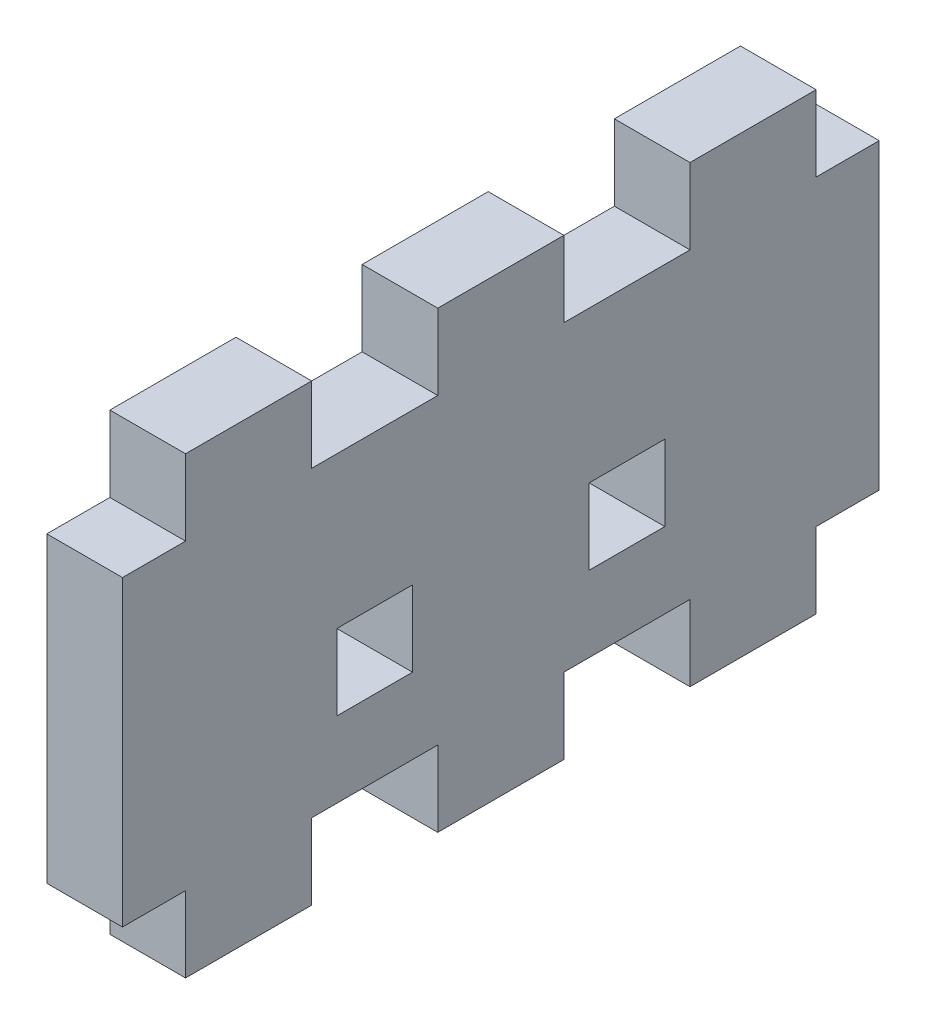
ISO-10303-21;
HEADER;
FILE_DESCRIPTION(('STEP AP214'),'2;1');
FILE_NAME('part.step','',(''),(''),'','','');
FILE_SCHEMA(('AUTOMOTIVE_DESIGN { 1 0 10303 214 1 1 1 1 }'));
ENDSEC;
DATA;
#1=APPLICATION_CONTEXT('core data for automotive mechanical design processes');
#2=APPLICATION_PROTOCOL_DEFINITION('international standard','automotive_design',2000,#1);
#3=PRODUCT_CONTEXT('',#1,'mechanical');
#4=PRODUCT('Part','Part','',(#3));
#5=PRODUCT_RELATED_PRODUCT_CATEGORY('part','',(#4));
#6=PRODUCT_DEFINITION_FORMATION('','',#4);
#7=PRODUCT_DEFINITION_CONTEXT('part definition',#1,'design');
#8=PRODUCT_DEFINITION('design','',#6,#7);
#9=PRODUCT_DEFINITION_SHAPE('','',#8);
#10=(LENGTH_UNIT() NAMED_UNIT(*) SI_UNIT(.MILLI.,.METRE.));
#11=(NAMED_UNIT(*) PLANE_ANGLE_UNIT() SI_UNIT($,.RADIAN.));
#12=(NAMED_UNIT(*) SI_UNIT($,.STERADIAN.) SOLID_ANGLE_UNIT());
#13=UNCERTAINTY_MEASURE_WITH_UNIT(LENGTH_MEASURE(1.E-05),#10,'distance_accuracy_value','');
#14=(GEOMETRIC_REPRESENTATION_CONTEXT(3) GLOBAL_UNCERTAINTY_ASSIGNED_CONTEXT((#13)) GLOBAL_UNIT_ASSIGNED_CONTEXT((#10,
#11,#12)) REPRESENTATION_CONTEXT('',''));
#15=CARTESIAN_POINT('',(0.,0.,0.));
#16=DIRECTION('',(0.,0.,1.));
#17=DIRECTION('',(1.,0.,0.));
#18=AXIS2_PLACEMENT_3D('',#15,#16,#17);
#19=CARTESIAN_POINT('',(3.,-6.,15.));
#20=DIRECTION('',(0.,1.,0.));
#21=DIRECTION('',(0.,0.,1.));
#22=AXIS2_PLACEMENT_3D('',#19,#20,#21);
#23=PLANE('',#22);
#24=DIRECTION('',(0.,0.,-1.));
#25=VECTOR('',#24,1.);
#26=CARTESIAN_POINT('',(3.,-6.,15.));
#27=LINE('',#26,#25);
#28=CARTESIAN_POINT('',(3.,-6.,7.50000000000001));
#29=VERTEX_POINT('',#28);
#30=CARTESIAN_POINT('',(3.,-6.,2.50000000000001));
#31=VERTEX_POINT('',#30);
#32=EDGE_CURVE('E493',#29,#31,#27,.T.);
#33=ORIENTED_EDGE('',*,*,#32,.F.);
#34=DIRECTION('',(1.,0.,0.));
#35=VECTOR('',#34,1.);
#36=CARTESIAN_POINT('',(0.,-6.,7.5));
#37=LINE('',#36,#35);
#38=CARTESIAN_POINT('',(0.,-6.,7.5));
#39=VERTEX_POINT('',#38);
#40=EDGE_CURVE('E333',#39,#29,#37,.T.);
#41=ORIENTED_EDGE('',*,*,#40,.F.);
#42=DIRECTION('',(0.,0.,-1.));
#43=VECTOR('',#42,1.);
#44=CARTESIAN_POINT('',(0.,-6.,15.));
#45=LINE('',#44,#43);
#46=CARTESIAN_POINT('',(0.,-6.,2.50000000000001));
#47=VERTEX_POINT('',#46);
#48=EDGE_CURVE('E504',#39,#47,#45,.T.);
#49=ORIENTED_EDGE('',*,*,#48,.T.);
#50=DIRECTION('',(1.,0.,0.));
#51=VECTOR('',#50,1.);
#52=CARTESIAN_POINT('',(0.,-6.,2.50000000000001));
#53=LINE('',#52,#51);
#54=EDGE_CURVE('E352',#47,#31,#53,.T.);
#55=ORIENTED_EDGE('',*,*,#54,.T.);
#56=EDGE_LOOP('',(#33,#41,#49,#55));
#57=FACE_BOUND('',#56,.T.);
#58=ADVANCED_FACE('F33',(#57),#23,.F.);
#59=CARTESIAN_POINT('',(3.,-6.,-2.49999999999999));
#60=VERTEX_POINT('',#59);
#61=CARTESIAN_POINT('',(3.,-6.,-7.49999999999999));
#62=VERTEX_POINT('',#61);
#63=EDGE_CURVE('E610',#60,#62,#27,.T.);
#64=ORIENTED_EDGE('',*,*,#63,.F.);
#65=DIRECTION('',(1.,0.,0.));
#66=VECTOR('',#65,1.);
#67=CARTESIAN_POINT('',(0.,-6.,-2.49999999999999));
#68=LINE('',#67,#66);
#69=CARTESIAN_POINT('',(0.,-6.,-2.49999999999999));
#70=VERTEX_POINT('',#69);
#71=EDGE_CURVE('E360',#70,#60,#68,.T.);
#72=ORIENTED_EDGE('',*,*,#71,.F.);
#73=CARTESIAN_POINT('',(0.,-6.,-7.49999999999999));
#74=VERTEX_POINT('',#73);
#75=EDGE_CURVE('E592',#70,#74,#45,.T.);
#76=ORIENTED_EDGE('',*,*,#75,.T.);
#77=DIRECTION('',(1.,0.,0.));
#78=VECTOR('',#77,1.);
#79=CARTESIAN_POINT('',(0.,-6.,-7.49999999999999));
#80=LINE('',#79,#78);
#81=EDGE_CURVE('E379',#74,#62,#80,.T.);
#82=ORIENTED_EDGE('',*,*,#81,.T.);
#83=EDGE_LOOP('',(#64,#72,#76,#82));
#84=FACE_BOUND('',#83,.T.);
#85=ADVANCED_FACE('F552',(#84),#23,.F.);
#86=DIRECTION('',(1.,0.,0.));
#87=VECTOR('',#86,1.);
#88=CARTESIAN_POINT('',(0.,-6.,-12.5));
#89=LINE('',#88,#87);
#90=CARTESIAN_POINT('',(0.,-6.,-12.5));
#91=VERTEX_POINT('',#90);
#92=CARTESIAN_POINT('',(3.,-6.,-12.5));
#93=VERTEX_POINT('',#92);
#94=EDGE_CURVE('E387',#91,#93,#89,.T.);
#95=ORIENTED_EDGE('',*,*,#94,.F.);
#96=CARTESIAN_POINT('',(0.,-6.,-15.));
#97=VERTEX_POINT('',#96);
#98=EDGE_CURVE('E502',#91,#97,#45,.T.);
#99=ORIENTED_EDGE('',*,*,#98,.T.);
#100=DIRECTION('',(-1.,0.,0.));
#101=VECTOR('',#100,1.);
#102=CARTESIAN_POINT('',(3.,-6.,-15.));
#103=LINE('',#102,#101);
#104=CARTESIAN_POINT('',(3.,-6.,-15.));
#105=VERTEX_POINT('',#104);
#106=EDGE_CURVE('E492',#105,#97,#103,.T.);
#107=ORIENTED_EDGE('',*,*,#106,.F.);
#108=EDGE_CURVE('E488',#93,#105,#27,.T.);
#109=ORIENTED_EDGE('',*,*,#108,.F.);
#110=EDGE_LOOP('',(#95,#99,#107,#109));
#111=FACE_BOUND('',#110,.T.);
#112=ADVANCED_FACE('F559',(#111),#23,.F.);
#113=CARTESIAN_POINT('',(3.,6.,15.));
#114=DIRECTION('',(0.,-1.,0.));
#115=DIRECTION('',(0.,0.,-1.));
#116=AXIS2_PLACEMENT_3D('',#113,#114,#115);
#117=PLANE('',#116);
#118=DIRECTION('',(0.,0.,1.));
#119=VECTOR('',#118,1.);
#120=CARTESIAN_POINT('',(3.,6.,15.));
#121=LINE('',#120,#119);
#122=CARTESIAN_POINT('',(3.,6.,-7.5));
#123=VERTEX_POINT('',#122);
#124=CARTESIAN_POINT('',(3.,6.,-2.5));
#125=VERTEX_POINT('',#124);
#126=EDGE_CURVE('E486',#123,#125,#121,.T.);
#127=ORIENTED_EDGE('',*,*,#126,.F.);
#128=DIRECTION('',(1.,0.,0.));
#129=VECTOR('',#128,1.);
#130=CARTESIAN_POINT('',(0.,6.,-7.5));
#131=LINE('',#130,#129);
#132=CARTESIAN_POINT('',(0.,6.,-7.5));
#133=VERTEX_POINT('',#132);
#134=EDGE_CURVE('E406',#133,#123,#131,.T.);
#135=ORIENTED_EDGE('',*,*,#134,.F.);
#136=DIRECTION('',(0.,0.,1.));
#137=VECTOR('',#136,1.);
#138=CARTESIAN_POINT('',(0.,6.,15.));
#139=LINE('',#138,#137);
#140=CARTESIAN_POINT('',(0.,6.,-2.5));
#141=VERTEX_POINT('',#140);
#142=EDGE_CURVE('E500',#133,#141,#139,.T.);
#143=ORIENTED_EDGE('',*,*,#142,.T.);
#144=DIRECTION('',(1.,0.,0.));
#145=VECTOR('',#144,1.);
#146=CARTESIAN_POINT('',(0.,6.,-2.5));
#147=LINE('',#146,#145);
#148=EDGE_CURVE('E446',#141,#125,#147,.T.);
#149=ORIENTED_EDGE('',*,*,#148,.T.);
#150=EDGE_LOOP('',(#127,#135,#143,#149));
#151=FACE_BOUND('',#150,.T.);
#152=ADVANCED_FACE('F575',(#151),#117,.F.);
#153=CARTESIAN_POINT('',(3.,6.,2.49999999999999));
#154=VERTEX_POINT('',#153);
#155=CARTESIAN_POINT('',(3.,6.,7.5));
#156=VERTEX_POINT('',#155);
#157=EDGE_CURVE('E632',#154,#156,#121,.T.);
#158=ORIENTED_EDGE('',*,*,#157,.F.);
#159=DIRECTION('',(1.,0.,0.));
#160=VECTOR('',#159,1.);
#161=CARTESIAN_POINT('',(0.,6.,2.49999999999999));
#162=LINE('',#161,#160);
#163=CARTESIAN_POINT('',(0.,6.,2.49999999999999));
#164=VERTEX_POINT('',#163);
#165=EDGE_CURVE('E433',#164,#154,#162,.T.);
#166=ORIENTED_EDGE('',*,*,#165,.F.);
#167=CARTESIAN_POINT('',(0.,6.,7.5));
#168=VERTEX_POINT('',#167);
#169=EDGE_CURVE('E659',#164,#168,#139,.T.);
#170=ORIENTED_EDGE('',*,*,#169,.T.);
#171=DIRECTION('',(1.,0.,0.));
#172=VECTOR('',#171,1.);
#173=CARTESIAN_POINT('',(0.,6.,7.5));
#174=LINE('',#173,#172);
#175=EDGE_CURVE('E473',#168,#156,#174,.T.);
#176=ORIENTED_EDGE('',*,*,#175,.T.);
#177=EDGE_LOOP('',(#158,#166,#170,#176));
#178=FACE_BOUND('',#177,.T.);
#179=ADVANCED_FACE('F580',(#178),#117,.F.);
#180=DIRECTION('',(1.,0.,0.));
#181=VECTOR('',#180,1.);
#182=CARTESIAN_POINT('',(0.,6.,12.5));
#183=LINE('',#182,#181);
#184=CARTESIAN_POINT('',(0.,6.,12.5));
#185=VERTEX_POINT('',#184);
#186=CARTESIAN_POINT('',(3.,6.,12.5));
#187=VERTEX_POINT('',#186);
#188=EDGE_CURVE('E460',#185,#187,#183,.T.);
#189=ORIENTED_EDGE('',*,*,#188,.F.);
#190=CARTESIAN_POINT('',(0.,6.,15.));
#191=VERTEX_POINT('',#190);
#192=EDGE_CURVE('E496',#185,#191,#139,.T.);
#193=ORIENTED_EDGE('',*,*,#192,.T.);
#194=DIRECTION('',(-1.,0.,0.));
#195=VECTOR('',#194,1.);
#196=CARTESIAN_POINT('',(3.,6.,15.));
#197=LINE('',#196,#195);
#198=CARTESIAN_POINT('',(3.,6.,15.));
#199=VERTEX_POINT('',#198);
#200=EDGE_CURVE('E510',#199,#191,#197,.T.);
#201=ORIENTED_EDGE('',*,*,#200,.F.);
#202=EDGE_CURVE('E480',#187,#199,#121,.T.);
#203=ORIENTED_EDGE('',*,*,#202,.F.);
#204=EDGE_LOOP('',(#189,#193,#201,#203));
#205=FACE_BOUND('',#204,.T.);
#206=ADVANCED_FACE('F641',(#205),#117,.F.);
#207=CARTESIAN_POINT('',(3.,6.,-15.));
#208=DIRECTION('',(0.,0.,1.));
#209=DIRECTION('',(0.,-1.,0.));
#210=AXIS2_PLACEMENT_3D('',#207,#208,#209);
#211=PLANE('',#210);
#212=DIRECTION('',(0.,1.,0.));
#213=VECTOR('',#212,1.);
#214=CARTESIAN_POINT('',(0.,6.,-15.));
#215=LINE('',#214,#213);
#216=CARTESIAN_POINT('',(0.,6.,-15.));
#217=VERTEX_POINT('',#216);
#218=EDGE_CURVE('E470',#97,#217,#215,.T.);
#219=ORIENTED_EDGE('',*,*,#218,.T.);
#220=DIRECTION('',(-1.,0.,0.));
#221=VECTOR('',#220,1.);
#222=CARTESIAN_POINT('',(3.,6.,-15.));
#223=LINE('',#222,#221);
#224=CARTESIAN_POINT('',(3.,6.,-15.));
#225=VERTEX_POINT('',#224);
#226=EDGE_CURVE('E513',#225,#217,#223,.T.);
#227=ORIENTED_EDGE('',*,*,#226,.F.);
#228=DIRECTION('',(0.,1.,0.));
#229=VECTOR('',#228,1.);
#230=CARTESIAN_POINT('',(3.,6.,-15.));
#231=LINE('',#230,#229);
#232=EDGE_CURVE('E477',#105,#225,#231,.T.);
#233=ORIENTED_EDGE('',*,*,#232,.F.);
#234=ORIENTED_EDGE('',*,*,#106,.T.);
#235=EDGE_LOOP('',(#219,#227,#233,#234));
#236=FACE_BOUND('',#235,.T.);
#237=ADVANCED_FACE('F35',(#236),#211,.F.);
#238=CARTESIAN_POINT('',(0.,6.,-12.5));
#239=VERTEX_POINT('',#238);
#240=EDGE_CURVE('E497',#217,#239,#139,.T.);
#241=ORIENTED_EDGE('',*,*,#240,.T.);
#242=DIRECTION('',(1.,0.,0.));
#243=VECTOR('',#242,1.);
#244=CARTESIAN_POINT('',(0.,6.,-12.5));
#245=LINE('',#244,#243);
#246=CARTESIAN_POINT('',(3.,6.,-12.5));
#247=VERTEX_POINT('',#246);
#248=EDGE_CURVE('E419',#239,#247,#245,.T.);
#249=ORIENTED_EDGE('',*,*,#248,.T.);
#250=EDGE_CURVE('E482',#225,#247,#121,.T.);
#251=ORIENTED_EDGE('',*,*,#250,.F.);
#252=ORIENTED_EDGE('',*,*,#226,.T.);
#253=EDGE_LOOP('',(#241,#249,#251,#252));
#254=FACE_BOUND('',#253,.T.);
#255=ADVANCED_FACE('F572',(#254),#117,.F.);
#256=CARTESIAN_POINT('',(3.,6.,15.));
#257=DIRECTION('',(0.,0.,-1.));
#258=DIRECTION('',(0.,1.,0.));
#259=AXIS2_PLACEMENT_3D('',#256,#257,#258);
#260=PLANE('',#259);
#261=DIRECTION('',(0.,-1.,0.));
#262=VECTOR('',#261,1.);
#263=CARTESIAN_POINT('',(0.,6.,15.));
#264=LINE('',#263,#262);
#265=CARTESIAN_POINT('',(0.,-6.,15.));
#266=VERTEX_POINT('',#265);
#267=EDGE_CURVE('E499',#191,#266,#264,.T.);
#268=ORIENTED_EDGE('',*,*,#267,.T.);
#269=DIRECTION('',(-1.,0.,0.));
#270=VECTOR('',#269,1.);
#271=CARTESIAN_POINT('',(3.,-6.,15.));
#272=LINE('',#271,#270);
#273=CARTESIAN_POINT('',(3.,-6.,15.));
#274=VERTEX_POINT('',#273);
#275=EDGE_CURVE('E507',#274,#266,#272,.T.);
#276=ORIENTED_EDGE('',*,*,#275,.F.);
#277=DIRECTION('',(0.,-1.,0.));
#278=VECTOR('',#277,1.);
#279=CARTESIAN_POINT('',(3.,6.,15.));
#280=LINE('',#279,#278);
#281=EDGE_CURVE('E485',#199,#274,#280,.T.);
#282=ORIENTED_EDGE('',*,*,#281,.F.);
#283=ORIENTED_EDGE('',*,*,#200,.T.);
#284=EDGE_LOOP('',(#268,#276,#282,#283));
#285=FACE_BOUND('',#284,.T.);
#286=ADVANCED_FACE('F564',(#285),#260,.F.);
#287=CARTESIAN_POINT('',(0.,-6.,12.5));
#288=VERTEX_POINT('',#287);
#289=EDGE_CURVE('E481',#266,#288,#45,.T.);
#290=ORIENTED_EDGE('',*,*,#289,.T.);
#291=DIRECTION('',(1.,0.,0.));
#292=VECTOR('',#291,1.);
#293=CARTESIAN_POINT('',(0.,-6.,12.5));
#294=LINE('',#293,#292);
#295=CARTESIAN_POINT('',(3.,-6.,12.5));
#296=VERTEX_POINT('',#295);
#297=EDGE_CURVE('E325',#288,#296,#294,.T.);
#298=ORIENTED_EDGE('',*,*,#297,.T.);
#299=EDGE_CURVE('E489',#274,#296,#27,.T.);
#300=ORIENTED_EDGE('',*,*,#299,.F.);
#301=ORIENTED_EDGE('',*,*,#275,.T.);
#302=EDGE_LOOP('',(#290,#298,#300,#301));
#303=FACE_BOUND('',#302,.T.);
#304=ADVANCED_FACE('F555',(#303),#23,.F.);
#305=CARTESIAN_POINT('',(3.,0.,0.));
#306=DIRECTION('',(1.,0.,0.));
#307=DIRECTION('',(0.,0.,-1.));
#308=AXIS2_PLACEMENT_3D('',#305,#306,#307);
#309=PLANE('',#308);
#310=DIRECTION('',(0.,-1.,0.));
#311=VECTOR('',#310,1.);
#312=CARTESIAN_POINT('',(3.,-3.,-3.5));
#313=LINE('',#312,#311);
#314=CARTESIAN_POINT('',(3.,0.,-3.5));
#315=VERTEX_POINT('',#314);
#316=CARTESIAN_POINT('',(3.,-3.,-3.5));
#317=VERTEX_POINT('',#316);
#318=EDGE_CURVE('E48',#315,#317,#313,.T.);
#319=ORIENTED_EDGE('',*,*,#318,.F.);
#320=DIRECTION('',(0.,0.,1.));
#321=VECTOR('',#320,1.);
#322=CARTESIAN_POINT('',(3.,0.,-3.5));
#323=LINE('',#322,#321);
#324=CARTESIAN_POINT('',(3.,0.,-6.5));
#325=VERTEX_POINT('',#324);
#326=EDGE_CURVE('E285',#325,#315,#323,.T.);
#327=ORIENTED_EDGE('',*,*,#326,.F.);
#328=DIRECTION('',(0.,1.,0.));
#329=VECTOR('',#328,1.);
#330=CARTESIAN_POINT('',(3.,-3.,-6.5));
#331=LINE('',#330,#329);
#332=CARTESIAN_POINT('',(3.,-3.,-6.5));
#333=VERTEX_POINT('',#332);
#334=EDGE_CURVE('E269',#333,#325,#331,.T.);
#335=ORIENTED_EDGE('',*,*,#334,.F.);
#336=DIRECTION('',(0.,0.,-1.));
#337=VECTOR('',#336,1.);
#338=CARTESIAN_POINT('',(3.,-3.,-3.5));
#339=LINE('',#338,#337);
#340=EDGE_CURVE('E278',#317,#333,#339,.T.);
#341=ORIENTED_EDGE('',*,*,#340,.F.);
#342=EDGE_LOOP('',(#319,#327,#335,#341));
#343=FACE_BOUND('',#342,.T.);
#344=DIRECTION('',(0.,-1.,0.));
#345=VECTOR('',#344,1.);
#346=CARTESIAN_POINT('',(3.,-3.,6.5));
#347=LINE('',#346,#345);
#348=CARTESIAN_POINT('',(3.,0.,6.5));
#349=VERTEX_POINT('',#348);
#350=CARTESIAN_POINT('',(3.,-3.,6.5));
#351=VERTEX_POINT('',#350);
#352=EDGE_CURVE('E292',#349,#351,#347,.T.);
#353=ORIENTED_EDGE('',*,*,#352,.F.);
#354=DIRECTION('',(0.,0.,1.));
#355=VECTOR('',#354,1.);
#356=CARTESIAN_POINT('',(3.,0.,6.5));
#357=LINE('',#356,#355);
#358=CARTESIAN_POINT('',(3.,0.,3.5));
#359=VERTEX_POINT('',#358);
#360=EDGE_CURVE('E302',#359,#349,#357,.T.);
#361=ORIENTED_EDGE('',*,*,#360,.F.);
#362=DIRECTION('',(0.,1.,0.));
#363=VECTOR('',#362,1.);
#364=CARTESIAN_POINT('',(3.,-3.,3.49999999999999));
#365=LINE('',#364,#363);
#366=CARTESIAN_POINT('',(3.,-3.,3.49999999999999));
#367=VERTEX_POINT('',#366);
#368=EDGE_CURVE('E299',#367,#359,#365,.T.);
#369=ORIENTED_EDGE('',*,*,#368,.F.);
#370=DIRECTION('',(0.,0.,-1.));
#371=VECTOR('',#370,1.);
#372=CARTESIAN_POINT('',(3.,-3.,6.5));
#373=LINE('',#372,#371);
#374=EDGE_CURVE('E296',#351,#367,#373,.T.);
#375=ORIENTED_EDGE('',*,*,#374,.F.);
#376=EDGE_LOOP('',(#353,#361,#369,#375));
#377=FACE_BOUND('',#376,.T.);
#378=ORIENTED_EDGE('',*,*,#232,.T.);
#379=ORIENTED_EDGE('',*,*,#250,.T.);
#380=DIRECTION('',(0.,1.,0.));
#381=VECTOR('',#380,1.);
#382=CARTESIAN_POINT('',(3.,6.,-12.5));
#383=LINE('',#382,#381);
#384=CARTESIAN_POINT('',(3.,9.,-12.5));
#385=VERTEX_POINT('',#384);
#386=EDGE_CURVE('E409',#247,#385,#383,.T.);
#387=ORIENTED_EDGE('',*,*,#386,.T.);
#388=DIRECTION('',(0.,0.,1.));
#389=VECTOR('',#388,1.);
#390=CARTESIAN_POINT('',(3.,9.,-7.5));
#391=LINE('',#390,#389);
#392=CARTESIAN_POINT('',(3.,9.,-7.5));
#393=VERTEX_POINT('',#392);
#394=EDGE_CURVE('E400',#385,#393,#391,.T.);
#395=ORIENTED_EDGE('',*,*,#394,.T.);
#396=DIRECTION('',(0.,-1.,0.));
#397=VECTOR('',#396,1.);
#398=CARTESIAN_POINT('',(3.,6.,-7.5));
#399=LINE('',#398,#397);
#400=EDGE_CURVE('E389',#393,#123,#399,.T.);
#401=ORIENTED_EDGE('',*,*,#400,.T.);
#402=ORIENTED_EDGE('',*,*,#126,.T.);
#403=DIRECTION('',(0.,1.,0.));
#404=VECTOR('',#403,1.);
#405=CARTESIAN_POINT('',(3.,6.,-2.5));
#406=LINE('',#405,#404);
#407=CARTESIAN_POINT('',(3.,9.,-2.50000000000001));
#408=VERTEX_POINT('',#407);
#409=EDGE_CURVE('E436',#125,#408,#406,.T.);
#410=ORIENTED_EDGE('',*,*,#409,.T.);
#411=DIRECTION('',(0.,0.,1.));
#412=VECTOR('',#411,1.);
#413=CARTESIAN_POINT('',(3.,9.,2.49999999999999));
#414=LINE('',#413,#412);
#415=CARTESIAN_POINT('',(3.,9.,2.49999999999999));
#416=VERTEX_POINT('',#415);
#417=EDGE_CURVE('E427',#408,#416,#414,.T.);
#418=ORIENTED_EDGE('',*,*,#417,.T.);
#419=DIRECTION('',(0.,-1.,0.));
#420=VECTOR('',#419,1.);
#421=CARTESIAN_POINT('',(3.,6.,2.49999999999999));
#422=LINE('',#421,#420);
#423=EDGE_CURVE('E416',#416,#154,#422,.T.);
#424=ORIENTED_EDGE('',*,*,#423,.T.);
#425=ORIENTED_EDGE('',*,*,#157,.T.);
#426=DIRECTION('',(0.,1.,0.));
#427=VECTOR('',#426,1.);
#428=CARTESIAN_POINT('',(3.,6.,7.5));
#429=LINE('',#428,#427);
#430=CARTESIAN_POINT('',(3.,9.,7.5));
#431=VERTEX_POINT('',#430);
#432=EDGE_CURVE('E463',#156,#431,#429,.T.);
#433=ORIENTED_EDGE('',*,*,#432,.T.);
#434=DIRECTION('',(0.,0.,1.));
#435=VECTOR('',#434,1.);
#436=CARTESIAN_POINT('',(3.,9.,12.5));
#437=LINE('',#436,#435);
#438=CARTESIAN_POINT('',(3.,9.,12.5));
#439=VERTEX_POINT('',#438);
#440=EDGE_CURVE('E454',#431,#439,#437,.T.);
#441=ORIENTED_EDGE('',*,*,#440,.T.);
#442=DIRECTION('',(0.,-1.,0.));
#443=VECTOR('',#442,1.);
#444=CARTESIAN_POINT('',(3.,6.,12.5));
#445=LINE('',#444,#443);
#446=EDGE_CURVE('E443',#439,#187,#445,.T.);
#447=ORIENTED_EDGE('',*,*,#446,.T.);
#448=ORIENTED_EDGE('',*,*,#202,.T.);
#449=ORIENTED_EDGE('',*,*,#281,.T.);
#450=ORIENTED_EDGE('',*,*,#299,.T.);
#451=DIRECTION('',(0.,-1.,0.));
#452=VECTOR('',#451,1.);
#453=CARTESIAN_POINT('',(3.,-6.,12.5));
#454=LINE('',#453,#452);
#455=CARTESIAN_POINT('',(3.,-9.,12.5));
#456=VERTEX_POINT('',#455);
#457=EDGE_CURVE('E308',#296,#456,#454,.T.);
#458=ORIENTED_EDGE('',*,*,#457,.T.);
#459=DIRECTION('',(0.,0.,-1.));
#460=VECTOR('',#459,1.);
#461=CARTESIAN_POINT('',(3.,-9.,12.5));
#462=LINE('',#461,#460);
#463=CARTESIAN_POINT('',(3.,-9.,7.50000000000001));
#464=VERTEX_POINT('',#463);
#465=EDGE_CURVE('E328',#456,#464,#462,.T.);
#466=ORIENTED_EDGE('',*,*,#465,.T.);
#467=DIRECTION('',(0.,1.,0.));
#468=VECTOR('',#467,1.);
#469=CARTESIAN_POINT('',(3.,-6.,7.5));
#470=LINE('',#469,#468);
#471=EDGE_CURVE('E319',#464,#29,#470,.T.);
#472=ORIENTED_EDGE('',*,*,#471,.T.);
#473=ORIENTED_EDGE('',*,*,#32,.T.);
#474=DIRECTION('',(0.,-1.,0.));
#475=VECTOR('',#474,1.);
#476=CARTESIAN_POINT('',(3.,-6.,2.50000000000001));
#477=LINE('',#476,#475);
#478=CARTESIAN_POINT('',(3.,-9.,2.50000000000001));
#479=VERTEX_POINT('',#478);
#480=EDGE_CURVE('E336',#31,#479,#477,.T.);
#481=ORIENTED_EDGE('',*,*,#480,.T.);
#482=DIRECTION('',(0.,0.,-1.));
#483=VECTOR('',#482,1.);
#484=CARTESIAN_POINT('',(3.,-9.,2.50000000000001));
#485=LINE('',#484,#483);
#486=CARTESIAN_POINT('',(3.,-9.,-2.49999999999999));
#487=VERTEX_POINT('',#486);
#488=EDGE_CURVE('E355',#479,#487,#485,.T.);
#489=ORIENTED_EDGE('',*,*,#488,.T.);
#490=DIRECTION('',(0.,1.,0.));
#491=VECTOR('',#490,1.);
#492=CARTESIAN_POINT('',(3.,-6.,-2.49999999999999));
#493=LINE('',#492,#491);
#494=EDGE_CURVE('E346',#487,#60,#493,.T.);
#495=ORIENTED_EDGE('',*,*,#494,.T.);
#496=ORIENTED_EDGE('',*,*,#63,.T.);
#497=DIRECTION('',(0.,-1.,0.));
#498=VECTOR('',#497,1.);
#499=CARTESIAN_POINT('',(3.,-6.,-7.49999999999999));
#500=LINE('',#499,#498);
#501=CARTESIAN_POINT('',(3.,-9.,-7.49999999999999));
#502=VERTEX_POINT('',#501);
#503=EDGE_CURVE('E363',#62,#502,#500,.T.);
#504=ORIENTED_EDGE('',*,*,#503,.T.);
#505=DIRECTION('',(0.,0.,-1.));
#506=VECTOR('',#505,1.);
#507=CARTESIAN_POINT('',(3.,-9.,-7.49999999999999));
#508=LINE('',#507,#506);
#509=CARTESIAN_POINT('',(3.,-9.,-12.5));
#510=VERTEX_POINT('',#509);
#511=EDGE_CURVE('E382',#502,#510,#508,.T.);
#512=ORIENTED_EDGE('',*,*,#511,.T.);
#513=DIRECTION('',(0.,1.,0.));
#514=VECTOR('',#513,1.);
#515=CARTESIAN_POINT('',(3.,-6.,-12.5));
#516=LINE('',#515,#514);
#517=EDGE_CURVE('E374',#510,#93,#516,.T.);
#518=ORIENTED_EDGE('',*,*,#517,.T.);
#519=ORIENTED_EDGE('',*,*,#108,.T.);
#520=EDGE_LOOP('',(#378,#379,#387,#395,#401,#402,#410,#418,#424,#425,#433,#441,#447,#448,#449,
#450,#458,#466,#472,#473,#481,#489,#495,#496,#504,#512,#518,#519));
#521=FACE_BOUND('',#520,.T.);
#522=ADVANCED_FACE('F282',(#343,#377,#521),#309,.T.);
#523=CARTESIAN_POINT('',(0.,0.,0.));
#524=DIRECTION('',(1.,0.,0.));
#525=DIRECTION('',(0.,0.,-1.));
#526=AXIS2_PLACEMENT_3D('',#523,#524,#525);
#527=PLANE('',#526);
#528=DIRECTION('',(0.,0.,1.));
#529=VECTOR('',#528,1.);
#530=CARTESIAN_POINT('',(0.,0.,0.));
#531=LINE('',#530,#529);
#532=CARTESIAN_POINT('',(0.,0.,-6.5));
#533=VERTEX_POINT('',#532);
#534=CARTESIAN_POINT('',(0.,0.,-3.5));
#535=VERTEX_POINT('',#534);
#536=EDGE_CURVE('E41',#533,#535,#531,.T.);
#537=ORIENTED_EDGE('',*,*,#536,.T.);
#538=DIRECTION('',(0.,-1.,0.));
#539=VECTOR('',#538,1.);
#540=CARTESIAN_POINT('',(0.,0.,-3.5));
#541=LINE('',#540,#539);
#542=CARTESIAN_POINT('',(0.,-3.,-3.5));
#543=VERTEX_POINT('',#542);
#544=EDGE_CURVE('E11',#535,#543,#541,.T.);
#545=ORIENTED_EDGE('',*,*,#544,.T.);
#546=DIRECTION('',(0.,0.,-1.));
#547=VECTOR('',#546,1.);
#548=CARTESIAN_POINT('',(0.,-3.,0.));
#549=LINE('',#548,#547);
#550=CARTESIAN_POINT('',(0.,-3.,-6.5));
#551=VERTEX_POINT('',#550);
#552=EDGE_CURVE('E528',#543,#551,#549,.T.);
#553=ORIENTED_EDGE('',*,*,#552,.T.);
#554=DIRECTION('',(0.,1.,0.));
#555=VECTOR('',#554,1.);
#556=CARTESIAN_POINT('',(0.,0.,-6.5));
#557=LINE('',#556,#555);
#558=EDGE_CURVE('E272',#551,#533,#557,.T.);
#559=ORIENTED_EDGE('',*,*,#558,.T.);
#560=EDGE_LOOP('',(#537,#545,#553,#559));
#561=FACE_BOUND('',#560,.T.);
#562=DIRECTION('',(0.,0.,1.));
#563=VECTOR('',#562,1.);
#564=CARTESIAN_POINT('',(0.,0.,0.));
#565=LINE('',#564,#563);
#566=CARTESIAN_POINT('',(0.,0.,3.5));
#567=VERTEX_POINT('',#566);
#568=CARTESIAN_POINT('',(0.,0.,6.5));
#569=VERTEX_POINT('',#568);
#570=EDGE_CURVE('E522',#567,#569,#565,.T.);
#571=ORIENTED_EDGE('',*,*,#570,.T.);
#572=DIRECTION('',(0.,-1.,0.));
#573=VECTOR('',#572,1.);
#574=CARTESIAN_POINT('',(0.,0.,6.5));
#575=LINE('',#574,#573);
#576=CARTESIAN_POINT('',(0.,-3.,6.5));
#577=VERTEX_POINT('',#576);
#578=EDGE_CURVE('E525',#569,#577,#575,.T.);
#579=ORIENTED_EDGE('',*,*,#578,.T.);
#580=DIRECTION('',(0.,0.,-1.));
#581=VECTOR('',#580,1.);
#582=CARTESIAN_POINT('',(0.,-3.,0.));
#583=LINE('',#582,#581);
#584=CARTESIAN_POINT('',(0.,-3.,3.49999999999999));
#585=VERTEX_POINT('',#584);
#586=EDGE_CURVE('E516',#577,#585,#583,.T.);
#587=ORIENTED_EDGE('',*,*,#586,.T.);
#588=DIRECTION('',(0.,1.,0.));
#589=VECTOR('',#588,1.);
#590=CARTESIAN_POINT('',(0.,0.,3.5));
#591=LINE('',#590,#589);
#592=EDGE_CURVE('E519',#585,#567,#591,.T.);
#593=ORIENTED_EDGE('',*,*,#592,.T.);
#594=EDGE_LOOP('',(#571,#579,#587,#593));
#595=FACE_BOUND('',#594,.T.);
#596=ORIENTED_EDGE('',*,*,#218,.F.);
#597=ORIENTED_EDGE('',*,*,#98,.F.);
#598=DIRECTION('',(0.,1.,0.));
#599=VECTOR('',#598,1.);
#600=CARTESIAN_POINT('',(0.,-6.,-12.5));
#601=LINE('',#600,#599);
#602=CARTESIAN_POINT('',(0.,-9.,-12.5));
#603=VERTEX_POINT('',#602);
#604=EDGE_CURVE('E377',#603,#91,#601,.T.);
#605=ORIENTED_EDGE('',*,*,#604,.F.);
#606=DIRECTION('',(0.,0.,-1.));
#607=VECTOR('',#606,1.);
#608=CARTESIAN_POINT('',(0.,-9.,-7.49999999999999));
#609=LINE('',#608,#607);
#610=CARTESIAN_POINT('',(0.,-9.,-7.49999999999999));
#611=VERTEX_POINT('',#610);
#612=EDGE_CURVE('E373',#611,#603,#609,.T.);
#613=ORIENTED_EDGE('',*,*,#612,.F.);
#614=DIRECTION('',(0.,-1.,0.));
#615=VECTOR('',#614,1.);
#616=CARTESIAN_POINT('',(0.,-6.,-7.49999999999999));
#617=LINE('',#616,#615);
#618=EDGE_CURVE('E370',#74,#611,#617,.T.);
#619=ORIENTED_EDGE('',*,*,#618,.F.);
#620=ORIENTED_EDGE('',*,*,#75,.F.);
#621=DIRECTION('',(0.,1.,0.));
#622=VECTOR('',#621,1.);
#623=CARTESIAN_POINT('',(0.,-6.,-2.49999999999999));
#624=LINE('',#623,#622);
#625=CARTESIAN_POINT('',(0.,-9.,-2.49999999999999));
#626=VERTEX_POINT('',#625);
#627=EDGE_CURVE('E349',#626,#70,#624,.T.);
#628=ORIENTED_EDGE('',*,*,#627,.F.);
#629=DIRECTION('',(0.,0.,-1.));
#630=VECTOR('',#629,1.);
#631=CARTESIAN_POINT('',(0.,-9.,2.50000000000001));
#632=LINE('',#631,#630);
#633=CARTESIAN_POINT('',(0.,-9.,2.50000000000001));
#634=VERTEX_POINT('',#633);
#635=EDGE_CURVE('E345',#634,#626,#632,.T.);
#636=ORIENTED_EDGE('',*,*,#635,.F.);
#637=DIRECTION('',(0.,-1.,0.));
#638=VECTOR('',#637,1.);
#639=CARTESIAN_POINT('',(0.,-6.,2.50000000000001));
#640=LINE('',#639,#638);
#641=EDGE_CURVE('E342',#47,#634,#640,.T.);
#642=ORIENTED_EDGE('',*,*,#641,.F.);
#643=ORIENTED_EDGE('',*,*,#48,.F.);
#644=DIRECTION('',(0.,1.,0.));
#645=VECTOR('',#644,1.);
#646=CARTESIAN_POINT('',(0.,-6.,7.5));
#647=LINE('',#646,#645);
#648=CARTESIAN_POINT('',(0.,-9.,7.50000000000001));
#649=VERTEX_POINT('',#648);
#650=EDGE_CURVE('E322',#649,#39,#647,.T.);
#651=ORIENTED_EDGE('',*,*,#650,.F.);
#652=DIRECTION('',(0.,0.,-1.));
#653=VECTOR('',#652,1.);
#654=CARTESIAN_POINT('',(0.,-9.,12.5));
#655=LINE('',#654,#653);
#656=CARTESIAN_POINT('',(0.,-9.,12.5));
#657=VERTEX_POINT('',#656);
#658=EDGE_CURVE('E318',#657,#649,#655,.T.);
#659=ORIENTED_EDGE('',*,*,#658,.F.);
#660=DIRECTION('',(0.,-1.,0.));
#661=VECTOR('',#660,1.);
#662=CARTESIAN_POINT('',(0.,-6.,12.5));
#663=LINE('',#662,#661);
#664=EDGE_CURVE('E315',#288,#657,#663,.T.);
#665=ORIENTED_EDGE('',*,*,#664,.F.);
#666=ORIENTED_EDGE('',*,*,#289,.F.);
#667=ORIENTED_EDGE('',*,*,#267,.F.);
#668=ORIENTED_EDGE('',*,*,#192,.F.);
#669=DIRECTION('',(0.,-1.,0.));
#670=VECTOR('',#669,1.);
#671=CARTESIAN_POINT('',(0.,6.,12.5));
#672=LINE('',#671,#670);
#673=CARTESIAN_POINT('',(0.,9.,12.5));
#674=VERTEX_POINT('',#673);
#675=EDGE_CURVE('E451',#674,#185,#672,.T.);
#676=ORIENTED_EDGE('',*,*,#675,.F.);
#677=DIRECTION('',(0.,0.,1.));
#678=VECTOR('',#677,1.);
#679=CARTESIAN_POINT('',(0.,9.,12.5));
#680=LINE('',#679,#678);
#681=CARTESIAN_POINT('',(0.,9.,7.5));
#682=VERTEX_POINT('',#681);
#683=EDGE_CURVE('E457',#682,#674,#680,.T.);
#684=ORIENTED_EDGE('',*,*,#683,.F.);
#685=DIRECTION('',(0.,1.,0.));
#686=VECTOR('',#685,1.);
#687=CARTESIAN_POINT('',(0.,6.,7.5));
#688=LINE('',#687,#686);
#689=EDGE_CURVE('E453',#168,#682,#688,.T.);
#690=ORIENTED_EDGE('',*,*,#689,.F.);
#691=ORIENTED_EDGE('',*,*,#169,.F.);
#692=DIRECTION('',(0.,-1.,0.));
#693=VECTOR('',#692,1.);
#694=CARTESIAN_POINT('',(0.,6.,2.49999999999999));
#695=LINE('',#694,#693);
#696=CARTESIAN_POINT('',(0.,9.,2.49999999999999));
#697=VERTEX_POINT('',#696);
#698=EDGE_CURVE('E423',#697,#164,#695,.T.);
#699=ORIENTED_EDGE('',*,*,#698,.F.);
#700=DIRECTION('',(0.,0.,1.));
#701=VECTOR('',#700,1.);
#702=CARTESIAN_POINT('',(0.,9.,2.49999999999999));
#703=LINE('',#702,#701);
#704=CARTESIAN_POINT('',(0.,9.,-2.50000000000001));
#705=VERTEX_POINT('',#704);
#706=EDGE_CURVE('E430',#705,#697,#703,.T.);
#707=ORIENTED_EDGE('',*,*,#706,.F.);
#708=DIRECTION('',(0.,1.,0.));
#709=VECTOR('',#708,1.);
#710=CARTESIAN_POINT('',(0.,6.,-2.5));
#711=LINE('',#710,#709);
#712=EDGE_CURVE('E426',#141,#705,#711,.T.);
#713=ORIENTED_EDGE('',*,*,#712,.F.);
#714=ORIENTED_EDGE('',*,*,#142,.F.);
#715=DIRECTION('',(0.,-1.,0.));
#716=VECTOR('',#715,1.);
#717=CARTESIAN_POINT('',(0.,6.,-7.5));
#718=LINE('',#717,#716);
#719=CARTESIAN_POINT('',(0.,9.,-7.5));
#720=VERTEX_POINT('',#719);
#721=EDGE_CURVE('E396',#720,#133,#718,.T.);
#722=ORIENTED_EDGE('',*,*,#721,.F.);
#723=DIRECTION('',(0.,0.,1.));
#724=VECTOR('',#723,1.);
#725=CARTESIAN_POINT('',(0.,9.,-7.5));
#726=LINE('',#725,#724);
#727=CARTESIAN_POINT('',(0.,9.,-12.5));
#728=VERTEX_POINT('',#727);
#729=EDGE_CURVE('E403',#728,#720,#726,.T.);
#730=ORIENTED_EDGE('',*,*,#729,.F.);
#731=DIRECTION('',(0.,1.,0.));
#732=VECTOR('',#731,1.);
#733=CARTESIAN_POINT('',(0.,6.,-12.5));
#734=LINE('',#733,#732);
#735=EDGE_CURVE('E399',#239,#728,#734,.T.);
#736=ORIENTED_EDGE('',*,*,#735,.F.);
#737=ORIENTED_EDGE('',*,*,#240,.F.);
#738=EDGE_LOOP('',(#596,#597,#605,#613,#619,#620,#628,#636,#642,#643,#651,#659,#665,#666,#667,
#668,#676,#684,#690,#691,#699,#707,#713,#714,#722,#730,#736,#737));
#739=FACE_BOUND('',#738,.T.);
#740=ADVANCED_FACE('F532',(#561,#595,#739),#527,.F.);
#741=CARTESIAN_POINT('',(0.,6.,12.5));
#742=DIRECTION('',(0.,0.,1.));
#743=DIRECTION('',(1.,0.,0.));
#744=AXIS2_PLACEMENT_3D('',#741,#742,#743);
#745=PLANE('',#744);
#746=ORIENTED_EDGE('',*,*,#446,.F.);
#747=DIRECTION('',(1.,0.,0.));
#748=VECTOR('',#747,1.);
#749=CARTESIAN_POINT('',(0.,9.,12.5));
#750=LINE('',#749,#748);
#751=EDGE_CURVE('E468',#674,#439,#750,.T.);
#752=ORIENTED_EDGE('',*,*,#751,.F.);
#753=ORIENTED_EDGE('',*,*,#675,.T.);
#754=ORIENTED_EDGE('',*,*,#188,.T.);
#755=EDGE_LOOP('',(#746,#752,#753,#754));
#756=FACE_BOUND('',#755,.T.);
#757=ADVANCED_FACE('F671',(#756),#745,.T.);
#758=CARTESIAN_POINT('',(0.,9.,12.5));
#759=DIRECTION('',(0.,1.,0.));
#760=DIRECTION('',(0.,0.,1.));
#761=AXIS2_PLACEMENT_3D('',#758,#759,#760);
#762=PLANE('',#761);
#763=ORIENTED_EDGE('',*,*,#440,.F.);
#764=DIRECTION('',(1.,0.,0.));
#765=VECTOR('',#764,1.);
#766=CARTESIAN_POINT('',(0.,9.,7.5));
#767=LINE('',#766,#765);
#768=EDGE_CURVE('E471',#682,#431,#767,.T.);
#769=ORIENTED_EDGE('',*,*,#768,.F.);
#770=ORIENTED_EDGE('',*,*,#683,.T.);
#771=ORIENTED_EDGE('',*,*,#751,.T.);
#772=EDGE_LOOP('',(#763,#769,#770,#771));
#773=FACE_BOUND('',#772,.T.);
#774=ADVANCED_FACE('F669',(#773),#762,.T.);
#775=CARTESIAN_POINT('',(0.,6.,7.5));
#776=DIRECTION('',(0.,0.,-1.));
#777=DIRECTION('',(0.,1.,0.));
#778=AXIS2_PLACEMENT_3D('',#775,#776,#777);
#779=PLANE('',#778);
#780=ORIENTED_EDGE('',*,*,#432,.F.);
#781=ORIENTED_EDGE('',*,*,#175,.F.);
#782=ORIENTED_EDGE('',*,*,#689,.T.);
#783=ORIENTED_EDGE('',*,*,#768,.T.);
#784=EDGE_LOOP('',(#780,#781,#782,#783));
#785=FACE_BOUND('',#784,.T.);
#786=ADVANCED_FACE('F666',(#785),#779,.T.);
#787=CARTESIAN_POINT('',(0.,6.,2.49999999999999));
#788=DIRECTION('',(0.,0.,1.));
#789=DIRECTION('',(0.,-1.,0.));
#790=AXIS2_PLACEMENT_3D('',#787,#788,#789);
#791=PLANE('',#790);
#792=ORIENTED_EDGE('',*,*,#423,.F.);
#793=DIRECTION('',(1.,0.,0.));
#794=VECTOR('',#793,1.);
#795=CARTESIAN_POINT('',(0.,9.,2.49999999999999));
#796=LINE('',#795,#794);
#797=EDGE_CURVE('E441',#697,#416,#796,.T.);
#798=ORIENTED_EDGE('',*,*,#797,.F.);
#799=ORIENTED_EDGE('',*,*,#698,.T.);
#800=ORIENTED_EDGE('',*,*,#165,.T.);
#801=EDGE_LOOP('',(#792,#798,#799,#800));
#802=FACE_BOUND('',#801,.T.);
#803=ADVANCED_FACE('F682',(#802),#791,.T.);
#804=CARTESIAN_POINT('',(0.,9.,2.49999999999999));
#805=DIRECTION('',(0.,1.,0.));
#806=DIRECTION('',(0.,0.,1.));
#807=AXIS2_PLACEMENT_3D('',#804,#805,#806);
#808=PLANE('',#807);
#809=ORIENTED_EDGE('',*,*,#417,.F.);
#810=DIRECTION('',(1.,0.,0.));
#811=VECTOR('',#810,1.);
#812=CARTESIAN_POINT('',(0.,9.,-2.50000000000001));
#813=LINE('',#812,#811);
#814=EDGE_CURVE('E444',#705,#408,#813,.T.);
#815=ORIENTED_EDGE('',*,*,#814,.F.);
#816=ORIENTED_EDGE('',*,*,#706,.T.);
#817=ORIENTED_EDGE('',*,*,#797,.T.);
#818=EDGE_LOOP('',(#809,#815,#816,#817));
#819=FACE_BOUND('',#818,.T.);
#820=ADVANCED_FACE('F686',(#819),#808,.T.);
#821=CARTESIAN_POINT('',(0.,6.,-2.5));
#822=DIRECTION('',(0.,0.,-1.));
#823=DIRECTION('',(0.,1.,0.));
#824=AXIS2_PLACEMENT_3D('',#821,#822,#823);
#825=PLANE('',#824);
#826=ORIENTED_EDGE('',*,*,#409,.F.);
#827=ORIENTED_EDGE('',*,*,#148,.F.);
#828=ORIENTED_EDGE('',*,*,#712,.T.);
#829=ORIENTED_EDGE('',*,*,#814,.T.);
#830=EDGE_LOOP('',(#826,#827,#828,#829));
#831=FACE_BOUND('',#830,.T.);
#832=ADVANCED_FACE('F688',(#831),#825,.T.);
#833=CARTESIAN_POINT('',(0.,6.,-7.5));
#834=DIRECTION('',(0.,0.,1.));
#835=DIRECTION('',(0.,-1.,0.));
#836=AXIS2_PLACEMENT_3D('',#833,#834,#835);
#837=PLANE('',#836);
#838=ORIENTED_EDGE('',*,*,#400,.F.);
#839=DIRECTION('',(1.,0.,0.));
#840=VECTOR('',#839,1.);
#841=CARTESIAN_POINT('',(0.,9.,-7.5));
#842=LINE('',#841,#840);
#843=EDGE_CURVE('E414',#720,#393,#842,.T.);
#844=ORIENTED_EDGE('',*,*,#843,.F.);
#845=ORIENTED_EDGE('',*,*,#721,.T.);
#846=ORIENTED_EDGE('',*,*,#134,.T.);
#847=EDGE_LOOP('',(#838,#844,#845,#846));
#848=FACE_BOUND('',#847,.T.);
#849=ADVANCED_FACE('F627',(#848),#837,.T.);
#850=CARTESIAN_POINT('',(0.,9.,-7.5));
#851=DIRECTION('',(0.,1.,0.));
#852=DIRECTION('',(0.,0.,1.));
#853=AXIS2_PLACEMENT_3D('',#850,#851,#852);
#854=PLANE('',#853);
#855=ORIENTED_EDGE('',*,*,#394,.F.);
#856=DIRECTION('',(1.,0.,0.));
#857=VECTOR('',#856,1.);
#858=CARTESIAN_POINT('',(0.,9.,-12.5));
#859=LINE('',#858,#857);
#860=EDGE_CURVE('E417',#728,#385,#859,.T.);
#861=ORIENTED_EDGE('',*,*,#860,.F.);
#862=ORIENTED_EDGE('',*,*,#729,.T.);
#863=ORIENTED_EDGE('',*,*,#843,.T.);
#864=EDGE_LOOP('',(#855,#861,#862,#863));
#865=FACE_BOUND('',#864,.T.);
#866=ADVANCED_FACE('F624',(#865),#854,.T.);
#867=CARTESIAN_POINT('',(0.,6.,-12.5));
#868=DIRECTION('',(0.,0.,-1.));
#869=DIRECTION('',(0.,1.,0.));
#870=AXIS2_PLACEMENT_3D('',#867,#868,#869);
#871=PLANE('',#870);
#872=ORIENTED_EDGE('',*,*,#386,.F.);
#873=ORIENTED_EDGE('',*,*,#248,.F.);
#874=ORIENTED_EDGE('',*,*,#735,.T.);
#875=ORIENTED_EDGE('',*,*,#860,.T.);
#876=EDGE_LOOP('',(#872,#873,#874,#875));
#877=FACE_BOUND('',#876,.T.);
#878=ADVANCED_FACE('F620',(#877),#871,.T.);
#879=CARTESIAN_POINT('',(0.,-6.,-12.5));
#880=DIRECTION('',(0.,0.,-1.));
#881=DIRECTION('',(0.,1.,0.));
#882=AXIS2_PLACEMENT_3D('',#879,#880,#881);
#883=PLANE('',#882);
#884=ORIENTED_EDGE('',*,*,#517,.F.);
#885=DIRECTION('',(1.,0.,0.));
#886=VECTOR('',#885,1.);
#887=CARTESIAN_POINT('',(0.,-9.,-12.5));
#888=LINE('',#887,#886);
#889=EDGE_CURVE('E390',#603,#510,#888,.T.);
#890=ORIENTED_EDGE('',*,*,#889,.F.);
#891=ORIENTED_EDGE('',*,*,#604,.T.);
#892=ORIENTED_EDGE('',*,*,#94,.T.);
#893=EDGE_LOOP('',(#884,#890,#891,#892));
#894=FACE_BOUND('',#893,.T.);
#895=ADVANCED_FACE('F699',(#894),#883,.T.);
#896=CARTESIAN_POINT('',(0.,-9.,-7.49999999999999));
#897=DIRECTION('',(0.,-1.,0.));
#898=DIRECTION('',(0.,0.,-1.));
#899=AXIS2_PLACEMENT_3D('',#896,#897,#898);
#900=PLANE('',#899);
#901=ORIENTED_EDGE('',*,*,#511,.F.);
#902=DIRECTION('',(1.,0.,0.));
#903=VECTOR('',#902,1.);
#904=CARTESIAN_POINT('',(0.,-9.,-7.49999999999999));
#905=LINE('',#904,#903);
#906=EDGE_CURVE('E392',#611,#502,#905,.T.);
#907=ORIENTED_EDGE('',*,*,#906,.F.);
#908=ORIENTED_EDGE('',*,*,#612,.T.);
#909=ORIENTED_EDGE('',*,*,#889,.T.);
#910=EDGE_LOOP('',(#901,#907,#908,#909));
#911=FACE_BOUND('',#910,.T.);
#912=ADVANCED_FACE('F706',(#911),#900,.T.);
#913=CARTESIAN_POINT('',(0.,-6.,-7.49999999999999));
#914=DIRECTION('',(0.,0.,1.));
#915=DIRECTION('',(0.,-1.,0.));
#916=AXIS2_PLACEMENT_3D('',#913,#914,#915);
#917=PLANE('',#916);
#918=ORIENTED_EDGE('',*,*,#503,.F.);
#919=ORIENTED_EDGE('',*,*,#81,.F.);
#920=ORIENTED_EDGE('',*,*,#618,.T.);
#921=ORIENTED_EDGE('',*,*,#906,.T.);
#922=EDGE_LOOP('',(#918,#919,#920,#921));
#923=FACE_BOUND('',#922,.T.);
#924=ADVANCED_FACE('F702',(#923),#917,.T.);
#925=CARTESIAN_POINT('',(0.,-6.,-2.49999999999999));
#926=DIRECTION('',(0.,0.,-1.));
#927=DIRECTION('',(0.,1.,0.));
#928=AXIS2_PLACEMENT_3D('',#925,#926,#927);
#929=PLANE('',#928);
#930=ORIENTED_EDGE('',*,*,#494,.F.);
#931=DIRECTION('',(1.,0.,0.));
#932=VECTOR('',#931,1.);
#933=CARTESIAN_POINT('',(0.,-9.,-2.49999999999999));
#934=LINE('',#933,#932);
#935=EDGE_CURVE('E364',#626,#487,#934,.T.);
#936=ORIENTED_EDGE('',*,*,#935,.F.);
#937=ORIENTED_EDGE('',*,*,#627,.T.);
#938=ORIENTED_EDGE('',*,*,#71,.T.);
#939=EDGE_LOOP('',(#930,#936,#937,#938));
#940=FACE_BOUND('',#939,.T.);
#941=ADVANCED_FACE('F705',(#940),#929,.T.);
#942=CARTESIAN_POINT('',(0.,-9.,2.50000000000001));
#943=DIRECTION('',(0.,-1.,0.));
#944=DIRECTION('',(0.,0.,-1.));
#945=AXIS2_PLACEMENT_3D('',#942,#943,#944);
#946=PLANE('',#945);
#947=ORIENTED_EDGE('',*,*,#488,.F.);
#948=DIRECTION('',(1.,0.,0.));
#949=VECTOR('',#948,1.);
#950=CARTESIAN_POINT('',(0.,-9.,2.50000000000001));
#951=LINE('',#950,#949);
#952=EDGE_CURVE('E366',#634,#479,#951,.T.);
#953=ORIENTED_EDGE('',*,*,#952,.F.);
#954=ORIENTED_EDGE('',*,*,#635,.T.);
#955=ORIENTED_EDGE('',*,*,#935,.T.);
#956=EDGE_LOOP('',(#947,#953,#954,#955));
#957=FACE_BOUND('',#956,.T.);
#958=ADVANCED_FACE('F606',(#957),#946,.T.);
#959=CARTESIAN_POINT('',(0.,-6.,2.50000000000001));
#960=DIRECTION('',(0.,0.,1.));
#961=DIRECTION('',(0.,-1.,0.));
#962=AXIS2_PLACEMENT_3D('',#959,#960,#961);
#963=PLANE('',#962);
#964=ORIENTED_EDGE('',*,*,#480,.F.);
#965=ORIENTED_EDGE('',*,*,#54,.F.);
#966=ORIENTED_EDGE('',*,*,#641,.T.);
#967=ORIENTED_EDGE('',*,*,#952,.T.);
#968=EDGE_LOOP('',(#964,#965,#966,#967));
#969=FACE_BOUND('',#968,.T.);
#970=ADVANCED_FACE('F601',(#969),#963,.T.);
#971=CARTESIAN_POINT('',(0.,-6.,7.5));
#972=DIRECTION('',(0.,0.,-1.));
#973=DIRECTION('',(0.,1.,0.));
#974=AXIS2_PLACEMENT_3D('',#971,#972,#973);
#975=PLANE('',#974);
#976=ORIENTED_EDGE('',*,*,#471,.F.);
#977=DIRECTION('',(1.,0.,0.));
#978=VECTOR('',#977,1.);
#979=CARTESIAN_POINT('',(0.,-9.,7.50000000000001));
#980=LINE('',#979,#978);
#981=EDGE_CURVE('E337',#649,#464,#980,.T.);
#982=ORIENTED_EDGE('',*,*,#981,.F.);
#983=ORIENTED_EDGE('',*,*,#650,.T.);
#984=ORIENTED_EDGE('',*,*,#40,.T.);
#985=EDGE_LOOP('',(#976,#982,#983,#984));
#986=FACE_BOUND('',#985,.T.);
#987=ADVANCED_FACE('F656',(#986),#975,.T.);
#988=CARTESIAN_POINT('',(0.,-9.,12.5));
#989=DIRECTION('',(0.,-1.,0.));
#990=DIRECTION('',(0.,0.,-1.));
#991=AXIS2_PLACEMENT_3D('',#988,#989,#990);
#992=PLANE('',#991);
#993=ORIENTED_EDGE('',*,*,#465,.F.);
#994=DIRECTION('',(1.,0.,0.));
#995=VECTOR('',#994,1.);
#996=CARTESIAN_POINT('',(0.,-9.,12.5));
#997=LINE('',#996,#995);
#998=EDGE_CURVE('E339',#657,#456,#997,.T.);
#999=ORIENTED_EDGE('',*,*,#998,.F.);
#1000=ORIENTED_EDGE('',*,*,#658,.T.);
#1001=ORIENTED_EDGE('',*,*,#981,.T.);
#1002=EDGE_LOOP('',(#993,#999,#1000,#1001));
#1003=FACE_BOUND('',#1002,.T.);
#1004=ADVANCED_FACE('F654',(#1003),#992,.T.);
#1005=CARTESIAN_POINT('',(0.,-6.,12.5));
#1006=DIRECTION('',(0.,0.,1.));
#1007=DIRECTION('',(1.,0.,0.));
#1008=AXIS2_PLACEMENT_3D('',#1005,#1006,#1007);
#1009=PLANE('',#1008);
#1010=ORIENTED_EDGE('',*,*,#457,.F.);
#1011=ORIENTED_EDGE('',*,*,#297,.F.);
#1012=ORIENTED_EDGE('',*,*,#664,.T.);
#1013=ORIENTED_EDGE('',*,*,#998,.T.);
#1014=EDGE_LOOP('',(#1010,#1011,#1012,#1013));
#1015=FACE_BOUND('',#1014,.T.);
#1016=ADVANCED_FACE('F649',(#1015),#1009,.T.);
#1017=CARTESIAN_POINT('',(-7.,-3.,6.5));
#1018=DIRECTION('',(0.,0.,1.));
#1019=DIRECTION('',(1.,0.,0.));
#1020=AXIS2_PLACEMENT_3D('',#1017,#1018,#1019);
#1021=PLANE('',#1020);
#1022=DIRECTION('',(1.,0.,0.));
#1023=VECTOR('',#1022,1.);
#1024=CARTESIAN_POINT('',(-7.,0.,6.5));
#1025=LINE('',#1024,#1023);
#1026=EDGE_CURVE('E306',#569,#349,#1025,.T.);
#1027=ORIENTED_EDGE('',*,*,#1026,.T.);
#1028=ORIENTED_EDGE('',*,*,#352,.T.);
#1029=DIRECTION('',(1.,0.,0.));
#1030=VECTOR('',#1029,1.);
#1031=CARTESIAN_POINT('',(-7.,-3.,6.5));
#1032=LINE('',#1031,#1030);
#1033=EDGE_CURVE('E305',#577,#351,#1032,.T.);
#1034=ORIENTED_EDGE('',*,*,#1033,.F.);
#1035=ORIENTED_EDGE('',*,*,#578,.F.);
#1036=EDGE_LOOP('',(#1027,#1028,#1034,#1035));
#1037=FACE_BOUND('',#1036,.T.);
#1038=ADVANCED_FACE('F722',(#1037),#1021,.F.);
#1039=CARTESIAN_POINT('',(-7.,0.,6.5));
#1040=DIRECTION('',(0.,1.,0.));
#1041=DIRECTION('',(0.,0.,1.));
#1042=AXIS2_PLACEMENT_3D('',#1039,#1040,#1041);
#1043=PLANE('',#1042);
#1044=DIRECTION('',(1.,0.,0.));
#1045=VECTOR('',#1044,1.);
#1046=CARTESIAN_POINT('',(-7.,0.,3.5));
#1047=LINE('',#1046,#1045);
#1048=EDGE_CURVE('E309',#567,#359,#1047,.T.);
#1049=ORIENTED_EDGE('',*,*,#1048,.T.);
#1050=ORIENTED_EDGE('',*,*,#360,.T.);
#1051=ORIENTED_EDGE('',*,*,#1026,.F.);
#1052=ORIENTED_EDGE('',*,*,#570,.F.);
#1053=EDGE_LOOP('',(#1049,#1050,#1051,#1052));
#1054=FACE_BOUND('',#1053,.T.);
#1055=ADVANCED_FACE('F728',(#1054),#1043,.F.);
#1056=CARTESIAN_POINT('',(-7.,-3.,3.49999999999999));
#1057=DIRECTION('',(0.,0.,-1.));
#1058=DIRECTION('',(0.,1.,0.));
#1059=AXIS2_PLACEMENT_3D('',#1056,#1057,#1058);
#1060=PLANE('',#1059);
#1061=DIRECTION('',(1.,0.,0.));
#1062=VECTOR('',#1061,1.);
#1063=CARTESIAN_POINT('',(-7.,-3.,3.49999999999999));
#1064=LINE('',#1063,#1062);
#1065=EDGE_CURVE('E311',#585,#367,#1064,.T.);
#1066=ORIENTED_EDGE('',*,*,#1065,.T.);
#1067=ORIENTED_EDGE('',*,*,#368,.T.);
#1068=ORIENTED_EDGE('',*,*,#1048,.F.);
#1069=ORIENTED_EDGE('',*,*,#592,.F.);
#1070=EDGE_LOOP('',(#1066,#1067,#1068,#1069));
#1071=FACE_BOUND('',#1070,.T.);
#1072=ADVANCED_FACE('F546',(#1071),#1060,.F.);
#1073=CARTESIAN_POINT('',(-7.,-3.,6.5));
#1074=DIRECTION('',(0.,-1.,0.));
#1075=DIRECTION('',(0.,0.,-1.));
#1076=AXIS2_PLACEMENT_3D('',#1073,#1074,#1075);
#1077=PLANE('',#1076);
#1078=ORIENTED_EDGE('',*,*,#1033,.T.);
#1079=ORIENTED_EDGE('',*,*,#374,.T.);
#1080=ORIENTED_EDGE('',*,*,#1065,.F.);
#1081=ORIENTED_EDGE('',*,*,#586,.F.);
#1082=EDGE_LOOP('',(#1078,#1079,#1080,#1081));
#1083=FACE_BOUND('',#1082,.T.);
#1084=ADVANCED_FACE('F539',(#1083),#1077,.F.);
#1085=CARTESIAN_POINT('',(-7.,-3.,-3.5));
#1086=DIRECTION('',(0.,0.,1.));
#1087=DIRECTION('',(0.,-1.,0.));
#1088=AXIS2_PLACEMENT_3D('',#1085,#1086,#1087);
#1089=PLANE('',#1088);
#1090=DIRECTION('',(1.,0.,0.));
#1091=VECTOR('',#1090,1.);
#1092=CARTESIAN_POINT('',(-7.,0.,-3.5));
#1093=LINE('',#1092,#1091);
#1094=EDGE_CURVE('E290',#535,#315,#1093,.T.);
#1095=ORIENTED_EDGE('',*,*,#1094,.T.);
#1096=ORIENTED_EDGE('',*,*,#318,.T.);
#1097=DIRECTION('',(1.,0.,0.));
#1098=VECTOR('',#1097,1.);
#1099=CARTESIAN_POINT('',(-7.,-3.,-3.5));
#1100=LINE('',#1099,#1098);
#1101=EDGE_CURVE('E275',#543,#317,#1100,.T.);
#1102=ORIENTED_EDGE('',*,*,#1101,.F.);
#1103=ORIENTED_EDGE('',*,*,#544,.F.);
#1104=EDGE_LOOP('',(#1095,#1096,#1102,#1103));
#1105=FACE_BOUND('',#1104,.T.);
#1106=ADVANCED_FACE('F537',(#1105),#1089,.F.);
#1107=CARTESIAN_POINT('',(-7.,0.,-3.5));
#1108=DIRECTION('',(0.,1.,0.));
#1109=DIRECTION('',(0.,0.,1.));
#1110=AXIS2_PLACEMENT_3D('',#1107,#1108,#1109);
#1111=PLANE('',#1110);
#1112=DIRECTION('',(1.,0.,0.));
#1113=VECTOR('',#1112,1.);
#1114=CARTESIAN_POINT('',(-7.,0.,-6.5));
#1115=LINE('',#1114,#1113);
#1116=EDGE_CURVE('E274',#533,#325,#1115,.T.);
#1117=ORIENTED_EDGE('',*,*,#1116,.T.);
#1118=ORIENTED_EDGE('',*,*,#326,.T.);
#1119=ORIENTED_EDGE('',*,*,#1094,.F.);
#1120=ORIENTED_EDGE('',*,*,#536,.F.);
#1121=EDGE_LOOP('',(#1117,#1118,#1119,#1120));
#1122=FACE_BOUND('',#1121,.T.);
#1123=ADVANCED_FACE('F536',(#1122),#1111,.F.);
#1124=CARTESIAN_POINT('',(-7.,-3.,-6.5));
#1125=DIRECTION('',(0.,0.,-1.));
#1126=DIRECTION('',(0.,1.,0.));
#1127=AXIS2_PLACEMENT_3D('',#1124,#1125,#1126);
#1128=PLANE('',#1127);
#1129=DIRECTION('',(1.,0.,0.));
#1130=VECTOR('',#1129,1.);
#1131=CARTESIAN_POINT('',(-7.,-3.,-6.5));
#1132=LINE('',#1131,#1130);
#1133=EDGE_CURVE('E56',#551,#333,#1132,.T.);
#1134=ORIENTED_EDGE('',*,*,#1133,.T.);
#1135=ORIENTED_EDGE('',*,*,#334,.T.);
#1136=ORIENTED_EDGE('',*,*,#1116,.F.);
#1137=ORIENTED_EDGE('',*,*,#558,.F.);
#1138=EDGE_LOOP('',(#1134,#1135,#1136,#1137));
#1139=FACE_BOUND('',#1138,.T.);
#1140=ADVANCED_FACE('F266',(#1139),#1128,.F.);
#1141=CARTESIAN_POINT('',(-7.,-3.,-3.5));
#1142=DIRECTION('',(0.,-1.,0.));
#1143=DIRECTION('',(0.,0.,-1.));
#1144=AXIS2_PLACEMENT_3D('',#1141,#1142,#1143);
#1145=PLANE('',#1144);
#1146=ORIENTED_EDGE('',*,*,#1101,.T.);
#1147=ORIENTED_EDGE('',*,*,#340,.T.);
#1148=ORIENTED_EDGE('',*,*,#1133,.F.);
#1149=ORIENTED_EDGE('',*,*,#552,.F.);
#1150=EDGE_LOOP('',(#1146,#1147,#1148,#1149));
#1151=FACE_BOUND('',#1150,.T.);
#1152=ADVANCED_FACE('F279',(#1151),#1145,.F.);
#1153=CLOSED_SHELL('',(#58,#85,#112,#152,#179,#206,#237,#255,#286,#304,#522,#740,#757,#774,#786,
#803,#820,#832,#849,#866,#878,#895,#912,#924,#941,#958,#970,#987,#1004,#1016,#1038,#1055,#1072,
#1084,#1106,#1123,#1140,#1152));
#1154=MANIFOLD_SOLID_BREP('B2',#1153);
#1155=ADVANCED_BREP_SHAPE_REPRESENTATION('',(#18,#1154),#14);
#1156=SHAPE_DEFINITION_REPRESENTATION(#9,#1155);
ENDSEC;
END-ISO-10303-21;
